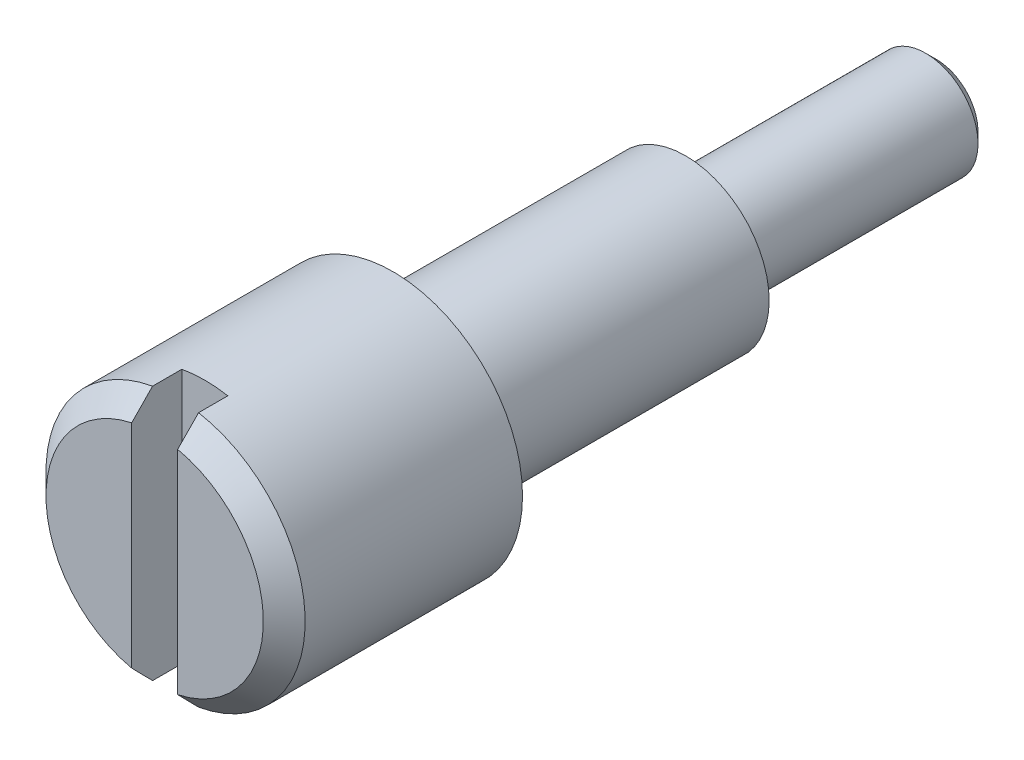
ISO-10303-21;
HEADER;
FILE_DESCRIPTION(('STEP AP214'),'2;1');
FILE_NAME('part.step','',(''),(''),'','','');
FILE_SCHEMA(('AUTOMOTIVE_DESIGN { 1 0 10303 214 1 1 1 1 }'));
ENDSEC;
DATA;
#1=APPLICATION_CONTEXT('core data for automotive mechanical design processes');
#2=APPLICATION_PROTOCOL_DEFINITION('international standard','automotive_design',2000,#1);
#3=PRODUCT_CONTEXT('',#1,'mechanical');
#4=PRODUCT('Part','Part','',(#3));
#5=PRODUCT_RELATED_PRODUCT_CATEGORY('part','',(#4));
#6=PRODUCT_DEFINITION_FORMATION('','',#4);
#7=PRODUCT_DEFINITION_CONTEXT('part definition',#1,'design');
#8=PRODUCT_DEFINITION('design','',#6,#7);
#9=PRODUCT_DEFINITION_SHAPE('','',#8);
#10=(LENGTH_UNIT() NAMED_UNIT(*) SI_UNIT(.MILLI.,.METRE.));
#11=(NAMED_UNIT(*) PLANE_ANGLE_UNIT() SI_UNIT($,.RADIAN.));
#12=(NAMED_UNIT(*) SI_UNIT($,.STERADIAN.) SOLID_ANGLE_UNIT());
#13=UNCERTAINTY_MEASURE_WITH_UNIT(LENGTH_MEASURE(1.E-05),#10,'distance_accuracy_value','');
#14=(GEOMETRIC_REPRESENTATION_CONTEXT(3) GLOBAL_UNCERTAINTY_ASSIGNED_CONTEXT((#13)) GLOBAL_UNIT_ASSIGNED_CONTEXT((#10,
#11,#12)) REPRESENTATION_CONTEXT('',''));
#15=CARTESIAN_POINT('',(0.,0.,0.));
#16=DIRECTION('',(0.,0.,1.));
#17=DIRECTION('',(1.,0.,0.));
#18=AXIS2_PLACEMENT_3D('',#15,#16,#17);
#19=CARTESIAN_POINT('',(0.,0.,5.7));
#20=DIRECTION('',(0.,0.,1.));
#21=DIRECTION('',(1.,0.,0.));
#22=AXIS2_PLACEMENT_3D('',#19,#20,#21);
#23=PLANE('',#22);
#24=DIRECTION('',(0.,1.,0.));
#25=VECTOR('',#24,1.);
#26=CARTESIAN_POINT('',(0.549999999999989,-3.50000000000007,5.69999999999998));
#27=LINE('',#26,#25);
#28=CARTESIAN_POINT('',(0.550000000000013,-2.54116115191469,5.7));
#29=VERTEX_POINT('',#28);
#30=CARTESIAN_POINT('',(0.549999999999971,2.54116115191465,5.7));
#31=VERTEX_POINT('',#30);
#32=EDGE_CURVE('E93',#29,#31,#27,.T.);
#33=ORIENTED_EDGE('',*,*,#32,.F.);
#34=CARTESIAN_POINT('',(0.,0.,5.7));
#35=DIRECTION('',(0.,0.,1.));
#36=DIRECTION('',(1.,0.,0.));
#37=AXIS2_PLACEMENT_3D('',#34,#35,#36);
#38=CIRCLE('',#37,2.6);
#39=EDGE_CURVE('E102',#29,#31,#38,.T.);
#40=ORIENTED_EDGE('',*,*,#39,.T.);
#41=EDGE_LOOP('',(#33,#40));
#42=FACE_BOUND('',#41,.T.);
#43=ADVANCED_FACE('F38',(#42),#23,.T.);
#44=CARTESIAN_POINT('',(0.,0.,5.7));
#45=DIRECTION('',(0.,0.,-1.));
#46=DIRECTION('',(-1.,0.,0.));
#47=AXIS2_PLACEMENT_3D('',#44,#45,#46);
#48=CONICAL_SURFACE('',#47,2.6,0.785398163397443);
#49=CARTESIAN_POINT('',(0.549999999999981,-6.81010362054149,1.46772283037984));
#50=CARTESIAN_POINT('',(0.549999999999968,-6.56766302612039,1.70936961033349));
#51=CARTESIAN_POINT('',(0.549999999999963,-6.32518719488942,1.95098107837741));
#52=CARTESIAN_POINT('',(0.549999999999959,-5.84010536127526,2.43409595939088));
#53=CARTESIAN_POINT('',(0.54999999999996,-5.59749935334166,2.67559936678706));
#54=CARTESIAN_POINT('',(0.549999999999961,-5.11184664048661,3.15871014823581));
#55=CARTESIAN_POINT('',(0.549999999999961,-4.86879974702007,3.40031733280349));
#56=CARTESIAN_POINT('',(0.549999999999961,-4.38245699087287,3.88325893119366));
#57=CARTESIAN_POINT('',(0.549999999999961,-4.13916114000075,4.12459335690603));
#58=CARTESIAN_POINT('',(0.549999999999961,-3.66492836984556,4.59417499355779));
#59=CARTESIAN_POINT('',(0.549999999999961,-3.43401317351567,4.82244412136169));
#60=CARTESIAN_POINT('',(0.549999999999961,-3.08710833741891,5.16434000318874));
#61=CARTESIAN_POINT('',(0.549999999999961,-2.97137673542495,5.27822848254313));
#62=CARTESIAN_POINT('',(0.549999999999961,-2.73966999515021,5.50575443023506));
#63=CARTESIAN_POINT('',(0.549999999999961,-2.62369486012454,5.61939190188651));
#64=CARTESIAN_POINT('',(0.549999999999961,-2.3914687361299,5.84622732702434));
#65=CARTESIAN_POINT('',(0.549999999999961,-2.27521798758484,5.95942552632142));
#66=CARTESIAN_POINT('',(0.549999999999961,-2.04216431942707,6.18526416075464));
#67=CARTESIAN_POINT('',(0.549999999999961,-1.92536137190728,6.29790456709905));
#68=CARTESIAN_POINT('',(0.54999999999996,-1.69089734295985,6.52223735248241));
#69=CARTESIAN_POINT('',(0.549999999999959,-1.5732364733955,6.63392995176102));
#70=CARTESIAN_POINT('',(0.549999999999962,-1.3955196817608,6.80015035197133));
#71=CARTESIAN_POINT('',(0.549999999999963,-1.33607899617753,6.85533513887057));
#72=CARTESIAN_POINT('',(0.549999999999958,-1.21660638813778,6.96506009221091));
#73=CARTESIAN_POINT('',(0.549999999999951,-1.15657448354666,7.01960027802158));
#74=CARTESIAN_POINT('',(0.549999999999955,-1.06240379345596,7.10376578448992));
#75=CARTESIAN_POINT('',(0.549999999999959,-1.02856881730916,7.13373071349409));
#76=CARTESIAN_POINT('',(0.549999999999962,-0.960542659622373,7.19326148579419));
#77=CARTESIAN_POINT('',(0.549999999999962,-0.926351441843123,7.22282728777194));
#78=CARTESIAN_POINT('',(0.54999999999996,-0.857208139466609,7.28168118472351));
#79=CARTESIAN_POINT('',(0.549999999999958,-0.822252004946021,7.31096453591665));
#80=CARTESIAN_POINT('',(0.549999999999963,-0.751729266103548,7.36877062789947));
#81=CARTESIAN_POINT('',(0.54999999999997,-0.716162829703579,7.39729357256621));
#82=CARTESIAN_POINT('',(0.54999999999997,-0.643847393354179,7.45352726863659));
#83=CARTESIAN_POINT('',(0.549999999999963,-0.60709039737414,7.48122780564399));
#84=CARTESIAN_POINT('',(0.549999999999959,-0.532327633152238,7.53501923360642));
#85=CARTESIAN_POINT('',(0.549999999999963,-0.494320299657957,7.56110797942064));
#86=CARTESIAN_POINT('',(0.549999999999959,-0.416948143322115,7.61046275001477));
#87=CARTESIAN_POINT('',(0.549999999999951,-0.377597835554684,7.63375115564689));
#88=CARTESIAN_POINT('',(0.549999999999971,-0.296694026287566,7.67602812398971));
#89=CARTESIAN_POINT('',(0.549999999999998,-0.255147663531901,7.69502967464132));
#90=CARTESIAN_POINT('',(0.549999999999985,-0.17958816759812,7.72221946218261));
#91=CARTESIAN_POINT('',(0.549999999999959,-0.146135878466005,7.73190500174314));
#92=CARTESIAN_POINT('',(0.549999999999962,-0.0781324813903925,7.74546584817642));
#93=CARTESIAN_POINT('',(0.54999999999999,-0.0435861131536746,7.74936343756233));
#94=CARTESIAN_POINT('',(0.549999999999992,0.0257950413628928,7.75049270268285));
#95=CARTESIAN_POINT('',(0.549999999999966,0.0606304083589959,7.74769122685318));
#96=CARTESIAN_POINT('',(0.549999999999956,0.129317980066075,7.73602910046961));
#97=CARTESIAN_POINT('',(0.549999999999972,0.163166569145006,7.72714852579228));
#98=CARTESIAN_POINT('',(0.549999999999977,0.230688924315118,7.70446798704345));
#99=CARTESIAN_POINT('',(0.549999999999965,0.264295323011527,7.69047663770966));
#100=CARTESIAN_POINT('',(0.549999999999957,0.329992576100289,7.65925215287141));
#101=CARTESIAN_POINT('',(0.54999999999996,0.362080477314673,7.64201300105965));
#102=CARTESIAN_POINT('',(0.549999999999961,0.425253479281891,7.60525098243725));
#103=CARTESIAN_POINT('',(0.549999999999959,0.456328067640498,7.58571037622956));
#104=CARTESIAN_POINT('',(0.549999999999963,0.517467168133229,7.54518201954394));
#105=CARTESIAN_POINT('',(0.54999999999997,0.547532547836729,7.52419556197579));
#106=CARTESIAN_POINT('',(0.549999999999971,0.609623318582727,7.47924370247191));
#107=CARTESIAN_POINT('',(0.549999999999963,0.641577824695685,7.45518107125367));
#108=CARTESIAN_POINT('',(0.549999999999958,0.704825160468684,7.40619849900135));
#109=CARTESIAN_POINT('',(0.54999999999996,0.736117901431429,7.3812784442068));
#110=CARTESIAN_POINT('',(0.549999999999963,0.829277808999687,7.30557713927021));
#111=CARTESIAN_POINT('',(0.549999999999961,0.89039633481371,7.25387746617289));
#112=CARTESIAN_POINT('',(0.54999999999996,1.011530993921,7.14900450826239));
#113=CARTESIAN_POINT('',(0.54999999999996,1.07154496773273,7.09582876073386));
#114=CARTESIAN_POINT('',(0.549999999999961,1.19076300555799,6.98861218312275));
#115=CARTESIAN_POINT('',(0.549999999999961,1.24996729450276,6.93457160273256));
#116=CARTESIAN_POINT('',(0.54999999999996,1.36762677650721,6.82609771960421));
#117=CARTESIAN_POINT('',(0.54999999999996,1.42608387721182,6.77166647908638));
#118=CARTESIAN_POINT('',(0.549999999999961,1.54261818807196,6.66239101471584));
#119=CARTESIAN_POINT('',(0.549999999999963,1.60069537081735,6.6075467616662));
#120=CARTESIAN_POINT('',(0.549999999999956,1.77438244279279,6.44269140919765));
#121=CARTESIAN_POINT('',(0.549999999999933,1.8895741751546,6.33224023571159));
#122=CARTESIAN_POINT('',(0.549999999999913,2.20736546243189,6.02578475254654));
#123=CARTESIAN_POINT('',(0.549999999999948,2.40929490766765,5.82908756243329));
#124=CARTESIAN_POINT('',(0.549999999999974,2.8122472560273,5.43476189934849));
#125=CARTESIAN_POINT('',(0.549999999999964,3.01327014117135,5.23713340806399));
#126=CARTESIAN_POINT('',(0.549999999999957,3.41490296061745,4.84125563875944));
#127=CARTESIAN_POINT('',(0.54999999999996,3.61551263643802,4.64300609854953));
#128=CARTESIAN_POINT('',(0.549999999999962,4.01642071708883,4.2461958420766));
#129=CARTESIAN_POINT('',(0.549999999999961,4.21671912428381,4.04763512820085));
#130=CARTESIAN_POINT('',(0.54999999999996,4.6166698776293,3.65074921786539));
#131=CARTESIAN_POINT('',(0.54999999999996,4.81632267231136,3.45242447334283));
#132=CARTESIAN_POINT('',(0.549999999999961,5.21549000015145,3.05563490577654));
#133=CARTESIAN_POINT('',(0.549999999999962,5.41500453295553,2.85717008237681));
#134=CARTESIAN_POINT('',(0.549999999999959,5.81382511805085,2.4602497458265));
#135=CARTESIAN_POINT('',(0.549999999999956,6.01313122467023,2.26179428725844));
#136=CARTESIAN_POINT('',(0.549999999999966,6.41166791686928,1.86480867314105));
#137=CARTESIAN_POINT('',(0.549999999999979,6.61089850266001,1.66627851780362));
#138=CARTESIAN_POINT('',(0.550000000000012,6.81010362054151,1.46772283037984));
#139=B_SPLINE_CURVE_WITH_KNOTS('',3,(#49,#50,#51,#52,#53,#54,#55,#56,#57,#58,#59,#60,#61,#62,
#63,#64,#65,#66,#67,#68,#69,#70,#71,#72,#73,#74,#75,#76,#77,#78,#79,#80,#81,#82,#83,#84,#85,#86,
#87,#88,#89,#90,#91,#92,#93,#94,#95,#96,#97,#98,#99,#100,#101,#102,#103,#104,#105,#106,#107,
#108,#109,#110,#111,#112,#113,#114,#115,#116,#117,#118,#119,#120,#121,#122,#123,#124,#125,#126,
#127,#128,#129,#130,#131,#132,#133,#134,#135,#136,#137,#138),.UNSPECIFIED.,.F.,.F.,(4,2,2,2,2,2,
2,2,2,2,2,2,2,2,2,2,2,2,2,2,2,2,2,2,2,2,2,2,2,2,2,2,2,2,2,2,2,2,2,2,2,2,2,2,4),(0.,
1.02690581406912,2.05385958687024,3.08197053796385,4.11003479616024,5.08412703166865,
5.57124020085457,6.05834690006942,6.54512324757357,7.03192446456293,7.51860928418801,
7.76193149399108,8.00524637354675,8.1408328771417,8.27643331083846,8.41322879174897,
8.54998721903925,8.68803720367462,8.8262671283275,8.96330623882111,9.09992441130855,
9.20402298989877,9.30771976021523,9.41193075431265,9.51648494350356,9.62544133996551,
9.7346015905684,9.84466635047882,9.95463393466169,10.0746171602955,10.1946163668085,
10.4347283552397,10.6752683932283,10.9157401930753,11.1553623461541,11.3950016008045,
11.8737626224392,12.7194429596122,13.5651399960796,14.4112622897591,15.2573781236191,
16.1016205668706,16.9458651634785,17.7896467705172,18.6334260017189),.UNSPECIFIED.);
#140=CARTESIAN_POINT('',(0.550000000000011,-3.05081956201944,5.19999999999999));
#141=VERTEX_POINT('',#140);
#142=EDGE_CURVE('E90',#141,#29,#139,.T.);
#143=ORIENTED_EDGE('',*,*,#142,.F.);
#144=CARTESIAN_POINT('',(0.,0.,5.2));
#145=DIRECTION('',(0.,0.,1.));
#146=DIRECTION('',(1.,0.,0.));
#147=AXIS2_PLACEMENT_3D('',#144,#145,#146);
#148=CIRCLE('',#147,3.1);
#149=CARTESIAN_POINT('',(0.549999999999978,3.05081956201938,5.2));
#150=VERTEX_POINT('',#149);
#151=EDGE_CURVE('E109',#150,#141,#148,.F.);
#152=ORIENTED_EDGE('',*,*,#151,.F.);
#153=EDGE_CURVE('E99',#31,#150,#139,.T.);
#154=ORIENTED_EDGE('',*,*,#153,.F.);
#155=ORIENTED_EDGE('',*,*,#39,.F.);
#156=EDGE_LOOP('',(#143,#152,#154,#155));
#157=FACE_BOUND('',#156,.T.);
#158=ADVANCED_FACE('F104',(#157),#48,.T.);
#159=CARTESIAN_POINT('',(0.,0.,-7.00000000000003));
#160=DIRECTION('',(0.,0.,-1.));
#161=DIRECTION('',(-1.,0.,0.));
#162=AXIS2_PLACEMENT_3D('',#159,#160,#161);
#163=PLANE('',#162);
#164=CARTESIAN_POINT('',(0.,0.,-7.00000000000003));
#165=DIRECTION('',(0.,0.,-1.));
#166=DIRECTION('',(-1.,0.,0.));
#167=AXIS2_PLACEMENT_3D('',#164,#165,#166);
#168=CIRCLE('',#167,2.);
#169=CARTESIAN_POINT('',(-2.00000000000001,0.,-7.00000000000003));
#170=VERTEX_POINT('',#169);
#171=EDGE_CURVE('E268',#170,#170,#168,.T.);
#172=ORIENTED_EDGE('',*,*,#171,.T.);
#173=EDGE_LOOP('',(#172));
#174=FACE_BOUND('',#173,.T.);
#175=CARTESIAN_POINT('',(0.,0.,-7.00000000000003));
#176=DIRECTION('',(0.,0.,-1.));
#177=DIRECTION('',(-1.,0.,0.));
#178=AXIS2_PLACEMENT_3D('',#175,#176,#177);
#179=CIRCLE('',#178,1.25);
#180=CARTESIAN_POINT('',(-1.25000000000001,0.,-7.00000000000003));
#181=VERTEX_POINT('',#180);
#182=EDGE_CURVE('E264',#181,#181,#179,.T.);
#183=ORIENTED_EDGE('',*,*,#182,.F.);
#184=EDGE_LOOP('',(#183));
#185=FACE_BOUND('',#184,.T.);
#186=ADVANCED_FACE('F147',(#174,#185),#163,.T.);
#187=CARTESIAN_POINT('',(0.,0.,0.));
#188=DIRECTION('',(0.,0.,1.));
#189=DIRECTION('',(1.,0.,0.));
#190=AXIS2_PLACEMENT_3D('',#187,#188,#189);
#191=PLANE('',#190);
#192=CARTESIAN_POINT('',(0.,0.,0.));
#193=DIRECTION('',(0.,0.,1.));
#194=DIRECTION('',(1.,0.,0.));
#195=AXIS2_PLACEMENT_3D('',#192,#193,#194);
#196=CIRCLE('',#195,3.1);
#197=CARTESIAN_POINT('',(3.1,0.,0.));
#198=VERTEX_POINT('',#197);
#199=EDGE_CURVE('E276',#198,#198,#196,.T.);
#200=ORIENTED_EDGE('',*,*,#199,.F.);
#201=EDGE_LOOP('',(#200));
#202=FACE_BOUND('',#201,.T.);
#203=CARTESIAN_POINT('',(0.,0.,0.));
#204=DIRECTION('',(0.,0.,1.));
#205=DIRECTION('',(1.,0.,0.));
#206=AXIS2_PLACEMENT_3D('',#203,#204,#205);
#207=CIRCLE('',#206,2.);
#208=CARTESIAN_POINT('',(2.,0.,0.));
#209=VERTEX_POINT('',#208);
#210=EDGE_CURVE('E279',#209,#209,#207,.F.);
#211=ORIENTED_EDGE('',*,*,#210,.F.);
#212=EDGE_LOOP('',(#211));
#213=FACE_BOUND('',#212,.T.);
#214=ADVANCED_FACE('F150',(#202,#213),#191,.F.);
#215=CARTESIAN_POINT('',(0.,0.,5.7));
#216=DIRECTION('',(0.,0.,-1.));
#217=DIRECTION('',(-1.,0.,0.));
#218=AXIS2_PLACEMENT_3D('',#215,#216,#217);
#219=CYLINDRICAL_SURFACE('',#218,3.1);
#220=CARTESIAN_POINT('',(0.,0.,4.5));
#221=DIRECTION('',(0.,0.,-1.));
#222=DIRECTION('',(-1.,0.,0.));
#223=AXIS2_PLACEMENT_3D('',#220,#221,#222);
#224=CIRCLE('',#223,3.1);
#225=CARTESIAN_POINT('',(-0.550000000000051,3.05081956201941,4.49999999999996));
#226=VERTEX_POINT('',#225);
#227=CARTESIAN_POINT('',(0.549999999999962,3.05081956201942,4.5));
#228=VERTEX_POINT('',#227);
#229=EDGE_CURVE('E11',#226,#228,#224,.T.);
#230=ORIENTED_EDGE('',*,*,#229,.T.);
#231=DIRECTION('',(0.,0.,-1.));
#232=VECTOR('',#231,1.);
#233=CARTESIAN_POINT('',(0.549999999999965,3.05081956201942,5.7));
#234=LINE('',#233,#232);
#235=EDGE_CURVE('E265',#228,#150,#234,.F.);
#236=ORIENTED_EDGE('',*,*,#235,.T.);
#237=ORIENTED_EDGE('',*,*,#151,.T.);
#238=DIRECTION('',(0.,0.,-1.));
#239=VECTOR('',#238,1.);
#240=CARTESIAN_POINT('',(0.550000000000012,-3.05081956201944,5.7));
#241=LINE('',#240,#239);
#242=CARTESIAN_POINT('',(0.549999999999984,-3.05081956201943,4.5));
#243=VERTEX_POINT('',#242);
#244=EDGE_CURVE('E62',#141,#243,#241,.T.);
#245=ORIENTED_EDGE('',*,*,#244,.T.);
#246=CARTESIAN_POINT('',(-0.550000000000013,-3.05081956201934,4.49999999999994));
#247=VERTEX_POINT('',#246);
#248=EDGE_CURVE('E43',#243,#247,#224,.T.);
#249=ORIENTED_EDGE('',*,*,#248,.T.);
#250=DIRECTION('',(0.,0.,-1.));
#251=VECTOR('',#250,1.);
#252=CARTESIAN_POINT('',(-0.550000000000037,-3.05081956201932,5.69999999999994));
#253=LINE('',#252,#251);
#254=CARTESIAN_POINT('',(-0.550000000000038,-3.05081956201932,5.19999999999993));
#255=VERTEX_POINT('',#254);
#256=EDGE_CURVE('E256',#247,#255,#253,.F.);
#257=ORIENTED_EDGE('',*,*,#256,.T.);
#258=CARTESIAN_POINT('',(-0.550000000000047,3.05081956201942,5.19999999999995));
#259=VERTEX_POINT('',#258);
#260=EDGE_CURVE('E116',#255,#259,#148,.F.);
#261=ORIENTED_EDGE('',*,*,#260,.T.);
#262=DIRECTION('',(0.,0.,-1.));
#263=VECTOR('',#262,1.);
#264=CARTESIAN_POINT('',(-0.550000000000047,3.05081956201942,5.69999999999995));
#265=LINE('',#264,#263);
#266=EDGE_CURVE('E270',#259,#226,#265,.T.);
#267=ORIENTED_EDGE('',*,*,#266,.T.);
#268=EDGE_LOOP('',(#230,#236,#237,#245,#249,#257,#261,#267));
#269=FACE_BOUND('',#268,.T.);
#270=ORIENTED_EDGE('',*,*,#199,.T.);
#271=EDGE_LOOP('',(#270));
#272=FACE_BOUND('',#271,.T.);
#273=ADVANCED_FACE('F158',(#269,#272),#219,.T.);
#274=DIRECTION('',(0.,-1.,0.));
#275=VECTOR('',#274,1.);
#276=CARTESIAN_POINT('',(-0.550000000000002,-3.5,5.69999999999996));
#277=LINE('',#276,#275);
#278=CARTESIAN_POINT('',(-0.550000000000044,2.54116115191468,5.69999999999994));
#279=VERTEX_POINT('',#278);
#280=CARTESIAN_POINT('',(-0.550000000000008,-2.5411611519146,5.69999999999995));
#281=VERTEX_POINT('',#280);
#282=EDGE_CURVE('E54',#279,#281,#277,.T.);
#283=ORIENTED_EDGE('',*,*,#282,.F.);
#284=EDGE_CURVE('E105',#279,#281,#38,.T.);
#285=ORIENTED_EDGE('',*,*,#284,.T.);
#286=EDGE_LOOP('',(#283,#285));
#287=FACE_BOUND('',#286,.T.);
#288=ADVANCED_FACE('F154',(#287),#23,.T.);
#289=CARTESIAN_POINT('',(0.,0.,-7.00000000000003));
#290=DIRECTION('',(0.,0.,1.));
#291=DIRECTION('',(1.,0.,0.));
#292=AXIS2_PLACEMENT_3D('',#289,#290,#291);
#293=CYLINDRICAL_SURFACE('',#292,2.);
#294=ORIENTED_EDGE('',*,*,#171,.F.);
#295=EDGE_LOOP('',(#294));
#296=FACE_BOUND('',#295,.T.);
#297=ORIENTED_EDGE('',*,*,#210,.T.);
#298=EDGE_LOOP('',(#297));
#299=FACE_BOUND('',#298,.T.);
#300=ADVANCED_FACE('F145',(#296,#299),#293,.T.);
#301=CARTESIAN_POINT('',(0.,0.,-13.));
#302=DIRECTION('',(0.,0.,1.));
#303=DIRECTION('',(1.,0.,0.));
#304=AXIS2_PLACEMENT_3D('',#301,#302,#303);
#305=CYLINDRICAL_SURFACE('',#304,1.25);
#306=CARTESIAN_POINT('',(0.,0.,-12.7465));
#307=DIRECTION('',(0.,0.,-1.));
#308=DIRECTION('',(-1.,0.,0.));
#309=AXIS2_PLACEMENT_3D('',#306,#307,#308);
#310=CIRCLE('',#309,1.25);
#311=CARTESIAN_POINT('',(-1.25,0.,-12.7465));
#312=VERTEX_POINT('',#311);
#313=EDGE_CURVE('E106',#312,#312,#310,.F.);
#314=ORIENTED_EDGE('',*,*,#313,.T.);
#315=EDGE_LOOP('',(#314));
#316=FACE_BOUND('',#315,.T.);
#317=ORIENTED_EDGE('',*,*,#182,.T.);
#318=EDGE_LOOP('',(#317));
#319=FACE_BOUND('',#318,.T.);
#320=ADVANCED_FACE('F141',(#316,#319),#305,.T.);
#321=CARTESIAN_POINT('',(0.,0.,-13.));
#322=DIRECTION('',(0.,0.,-1.));
#323=DIRECTION('',(-1.,0.,0.));
#324=AXIS2_PLACEMENT_3D('',#321,#322,#323);
#325=PLANE('',#324);
#326=CARTESIAN_POINT('',(0.,0.,-13.));
#327=DIRECTION('',(0.,0.,-1.));
#328=DIRECTION('',(-1.,0.,0.));
#329=AXIS2_PLACEMENT_3D('',#326,#327,#328);
#330=CIRCLE('',#329,0.996500000000004);
#331=CARTESIAN_POINT('',(-0.996500000000018,0.,-13.));
#332=VERTEX_POINT('',#331);
#333=EDGE_CURVE('E111',#332,#332,#330,.T.);
#334=ORIENTED_EDGE('',*,*,#333,.T.);
#335=EDGE_LOOP('',(#334));
#336=FACE_BOUND('',#335,.T.);
#337=ADVANCED_FACE('F137',(#336),#325,.T.);
#338=CARTESIAN_POINT('',(0.,0.,-13.));
#339=DIRECTION('',(0.,0.,1.));
#340=DIRECTION('',(1.,0.,0.));
#341=AXIS2_PLACEMENT_3D('',#338,#339,#340);
#342=CONICAL_SURFACE('',#341,0.996500000000004,0.785398163397446);
#343=ORIENTED_EDGE('',*,*,#313,.F.);
#344=EDGE_LOOP('',(#343));
#345=FACE_BOUND('',#344,.T.);
#346=ORIENTED_EDGE('',*,*,#333,.F.);
#347=EDGE_LOOP('',(#346));
#348=FACE_BOUND('',#347,.T.);
#349=ADVANCED_FACE('F140',(#345,#348),#342,.T.);
#350=CARTESIAN_POINT('',(-0.550000000000051,6.81010362054157,1.46772283037979));
#351=CARTESIAN_POINT('',(-0.550000000000025,6.56766302612052,1.70936961033343));
#352=CARTESIAN_POINT('',(-0.550000000000014,6.32518719488959,1.95098107837732));
#353=CARTESIAN_POINT('',(-0.550000000000006,5.8401053612755,2.43409595939074));
#354=CARTESIAN_POINT('',(-0.550000000000009,5.59749935334192,2.67559936678688));
#355=CARTESIAN_POINT('',(-0.550000000000011,5.11184664048695,3.15871014823556));
#356=CARTESIAN_POINT('',(-0.55000000000001,4.86879974702045,3.4003173328032));
#357=CARTESIAN_POINT('',(-0.550000000000009,4.38245699087332,3.8832589311933));
#358=CARTESIAN_POINT('',(-0.55000000000001,4.13916114000124,4.12459335690563));
#359=CARTESIAN_POINT('',(-0.55000000000001,3.66492836984605,4.59417499355739));
#360=CARTESIAN_POINT('',(-0.55000000000001,3.43401317351613,4.82244412136132));
#361=CARTESIAN_POINT('',(-0.55000000000001,3.08710833741932,5.16434000318842));
#362=CARTESIAN_POINT('',(-0.55000000000001,2.97137673542535,5.27822848254282));
#363=CARTESIAN_POINT('',(-0.55000000000001,2.73966999515057,5.50575443023479));
#364=CARTESIAN_POINT('',(-0.550000000000009,2.62369486012489,5.61939190188625));
#365=CARTESIAN_POINT('',(-0.55000000000001,2.39146873613022,5.84622732702412));
#366=CARTESIAN_POINT('',(-0.550000000000011,2.27521798758514,5.95942552632121));
#367=CARTESIAN_POINT('',(-0.550000000000009,2.04216431942734,6.18526416075447));
#368=CARTESIAN_POINT('',(-0.550000000000006,1.92536137190754,6.2979045670989));
#369=CARTESIAN_POINT('',(-0.550000000000013,1.69089734296007,6.52223735248228));
#370=CARTESIAN_POINT('',(-0.550000000000023,1.57323647339569,6.63392995176091));
#371=CARTESIAN_POINT('',(-0.550000000000003,1.39551968176098,6.80015035197126));
#372=CARTESIAN_POINT('',(-0.549999999999991,1.3360789961777,6.85533513887051));
#373=CARTESIAN_POINT('',(-0.550000000000029,1.21660638813791,6.96506009221085));
#374=CARTESIAN_POINT('',(-0.550000000000079,1.15657448354675,7.01960027802149));
#375=CARTESIAN_POINT('',(-0.550000000000051,1.06240379345605,7.10376578448987));
#376=CARTESIAN_POINT('',(-0.55000000000002,1.02856881730927,7.13373071349406));
#377=CARTESIAN_POINT('',(-0.549999999999999,0.960542659622486,7.19326148579419));
#378=CARTESIAN_POINT('',(-0.550000000000008,0.926351441843226,7.22282728777193));
#379=CARTESIAN_POINT('',(-0.550000000000011,0.857208139466706,7.2816811847235));
#380=CARTESIAN_POINT('',(-0.550000000000005,0.822252004946122,7.31096453591666));
#381=CARTESIAN_POINT('',(-0.550000000000014,0.751729266103632,7.36877062789947));
#382=CARTESIAN_POINT('',(-0.55000000000003,0.716162829703642,7.39729357256619));
#383=CARTESIAN_POINT('',(-0.55000000000003,0.643847393354236,7.45352726863657));
#384=CARTESIAN_POINT('',(-0.550000000000014,0.607090397374212,7.48122780564399));
#385=CARTESIAN_POINT('',(-0.550000000000005,0.532327633152321,7.53501923360644));
#386=CARTESIAN_POINT('',(-0.550000000000012,0.494320299658034,7.56110797942065));
#387=CARTESIAN_POINT('',(-0.550000000000007,0.416948143322193,7.61046275001478));
#388=CARTESIAN_POINT('',(-0.549999999999995,0.377597835554768,7.63375115564692));
#389=CARTESIAN_POINT('',(-0.550000000000024,0.296694026287629,7.67602812398971));
#390=CARTESIAN_POINT('',(-0.550000000000065,0.255147663531937,7.69502967464127));
#391=CARTESIAN_POINT('',(-0.550000000000045,0.179588167598153,7.72221946218258));
#392=CARTESIAN_POINT('',(-0.550000000000006,0.146135878466052,7.73190500174315));
#393=CARTESIAN_POINT('',(-0.550000000000013,0.0781324813904536,7.74546584817644));
#394=CARTESIAN_POINT('',(-0.550000000000058,0.0435861131537359,7.74936343756231));
#395=CARTESIAN_POINT('',(-0.550000000000058,-0.0257950413628317,7.75049270268283));
#396=CARTESIAN_POINT('',(-0.550000000000013,-0.0606304083589353,7.74769122685318));
#397=CARTESIAN_POINT('',(-0.550000000000007,-0.129317980066004,7.73602910046961));
#398=CARTESIAN_POINT('',(-0.550000000000046,-0.163166569144924,7.72714852579224));
#399=CARTESIAN_POINT('',(-0.550000000000056,-0.230688924315039,7.7044679870434));
#400=CARTESIAN_POINT('',(-0.550000000000022,-0.264295323011465,7.69047663770964));
#401=CARTESIAN_POINT('',(-0.549999999999997,-0.32999257610024,7.65925215287141));
#402=CARTESIAN_POINT('',(-0.550000000000006,-0.362080477314621,7.64201300105964));
#403=CARTESIAN_POINT('',(-0.550000000000014,-0.425253479281841,7.60525098243723));
#404=CARTESIAN_POINT('',(-0.550000000000013,-0.456328067640451,7.58571037622955));
#405=CARTESIAN_POINT('',(-0.550000000000006,-0.517467168133177,7.54518201954392));
#406=CARTESIAN_POINT('',(-0.549999999999999,-0.547532547836666,7.52419556197574));
#407=CARTESIAN_POINT('',(-0.549999999999998,-0.609623318582664,7.47924370247186));
#408=CARTESIAN_POINT('',(-0.550000000000006,-0.641577824695633,7.45518107125364));
#409=CARTESIAN_POINT('',(-0.550000000000013,-0.704825160468639,7.40619849900133));
#410=CARTESIAN_POINT('',(-0.550000000000011,-0.736117901431379,7.38127844420678));
#411=CARTESIAN_POINT('',(-0.550000000000007,-0.829277808999629,7.30557713927018));
#412=CARTESIAN_POINT('',(-0.550000000000009,-0.890396334813652,7.25387746617287));
#413=CARTESIAN_POINT('',(-0.55000000000001,-1.01153099392094,7.14900450826237));
#414=CARTESIAN_POINT('',(-0.55000000000001,-1.07154496773266,7.09582876073385));
#415=CARTESIAN_POINT('',(-0.550000000000009,-1.19076300555791,6.98861218312275));
#416=CARTESIAN_POINT('',(-0.550000000000009,-1.24996729450268,6.93457160273256));
#417=CARTESIAN_POINT('',(-0.55000000000001,-1.36762677650712,6.82609771960421));
#418=CARTESIAN_POINT('',(-0.550000000000011,-1.42608387721173,6.77166647908639));
#419=CARTESIAN_POINT('',(-0.550000000000009,-1.54261818807187,6.66239101471585));
#420=CARTESIAN_POINT('',(-0.550000000000006,-1.60069537081726,6.60754676166621));
#421=CARTESIAN_POINT('',(-0.550000000000017,-1.77438244279269,6.44269140919766));
#422=CARTESIAN_POINT('',(-0.550000000000048,-1.88957417515448,6.33224023571158));
#423=CARTESIAN_POINT('',(-0.550000000000076,-2.20736546243176,6.0257847525465));
#424=CARTESIAN_POINT('',(-0.550000000000027,-2.40929490766756,5.82908756243327));
#425=CARTESIAN_POINT('',(-0.549999999999992,-2.81224725602726,5.43476189934846));
#426=CARTESIAN_POINT('',(-0.550000000000005,-3.01327014117131,5.23713340806395));
#427=CARTESIAN_POINT('',(-0.550000000000014,-3.41490296061743,4.84125563875938));
#428=CARTESIAN_POINT('',(-0.550000000000011,-3.61551263643801,4.64300609854945));
#429=CARTESIAN_POINT('',(-0.550000000000008,-4.01642071708884,4.24619584207651));
#430=CARTESIAN_POINT('',(-0.550000000000009,-4.21671912428383,4.04763512820074));
#431=CARTESIAN_POINT('',(-0.55000000000001,-4.61666987762933,3.65074921786528));
#432=CARTESIAN_POINT('',(-0.550000000000009,-4.81632267231138,3.45242447334273));
#433=CARTESIAN_POINT('',(-0.55000000000001,-5.21549000015146,3.05563490577645));
#434=CARTESIAN_POINT('',(-0.550000000000011,-5.41500453295552,2.85717008237673));
#435=CARTESIAN_POINT('',(-0.550000000000009,-5.81382511805083,2.46024974582643));
#436=CARTESIAN_POINT('',(-0.550000000000006,-6.01313122467021,2.26179428725838));
#437=CARTESIAN_POINT('',(-0.550000000000013,-6.41166791686924,1.864808673141));
#438=CARTESIAN_POINT('',(-0.550000000000023,-6.61089850265996,1.66627851780358));
#439=CARTESIAN_POINT('',(-0.550000000000047,-6.81010362054146,1.46772283037979));
#440=B_SPLINE_CURVE_WITH_KNOTS('',3,(#350,#351,#352,#353,#354,#355,#356,#357,#358,#359,#360,
#361,#362,#363,#364,#365,#366,#367,#368,#369,#370,#371,#372,#373,#374,#375,#376,#377,#378,#379,
#380,#381,#382,#383,#384,#385,#386,#387,#388,#389,#390,#391,#392,#393,#394,#395,#396,#397,#398,
#399,#400,#401,#402,#403,#404,#405,#406,#407,#408,#409,#410,#411,#412,#413,#414,#415,#416,#417,
#418,#419,#420,#421,#422,#423,#424,#425,#426,#427,#428,#429,#430,#431,#432,#433,#434,#435,#436,
#437,#438,#439),.UNSPECIFIED.,.F.,.F.,(4,2,2,2,2,2,2,2,2,2,2,2,2,2,2,2,2,2,2,2,2,2,2,2,2,2,2,2,
2,2,2,2,2,2,2,2,2,2,2,2,2,2,2,2,4),(0.,1.02690581406898,2.05385958686997,3.08197053796342,
4.11003479615965,5.0841270316682,5.57124020085419,6.0583469000691,6.54512324757333,
7.03192446456276,7.51860928418791,7.76193149399103,8.00524637354673,8.1408328771417,
8.27643331083847,8.413228791749,8.54998721903929,8.68803720367466,8.82626712832754,
8.96330623882116,9.09992441130862,9.20402298989884,9.30771976021528,9.4119307543127,
9.5164849435036,9.62544133996557,9.73460159056845,9.84466635047888,9.95463393466176,
10.0746171602956,10.1946163668086,10.4347283552397,10.6752683932284,10.9157401930753,
11.1553623461541,11.3950016008045,11.8737626224392,12.7194429596122,13.5651399960797,
14.4112622897592,15.2573781236193,16.1016205668707,16.9458651634786,17.7896467705173,
18.633426001719),.UNSPECIFIED.);
#441=EDGE_CURVE('E123',#259,#279,#440,.T.);
#442=ORIENTED_EDGE('',*,*,#441,.F.);
#443=ORIENTED_EDGE('',*,*,#260,.F.);
#444=EDGE_CURVE('E117',#281,#255,#440,.T.);
#445=ORIENTED_EDGE('',*,*,#444,.F.);
#446=ORIENTED_EDGE('',*,*,#284,.F.);
#447=EDGE_LOOP('',(#442,#443,#445,#446));
#448=FACE_BOUND('',#447,.T.);
#449=ADVANCED_FACE('F40',(#448),#48,.T.);
#450=CARTESIAN_POINT('',(0.,0.,4.5));
#451=DIRECTION('',(0.,0.,-1.));
#452=DIRECTION('',(-1.,0.,0.));
#453=AXIS2_PLACEMENT_3D('',#450,#451,#452);
#454=PLANE('',#453);
#455=DIRECTION('',(0.,-1.,0.));
#456=VECTOR('',#455,1.);
#457=CARTESIAN_POINT('',(-0.55000000000001,-3.49999999999999,4.49999999999996));
#458=LINE('',#457,#456);
#459=EDGE_CURVE('E252',#226,#247,#458,.T.);
#460=ORIENTED_EDGE('',*,*,#459,.T.);
#461=ORIENTED_EDGE('',*,*,#248,.F.);
#462=DIRECTION('',(0.,1.,0.));
#463=VECTOR('',#462,1.);
#464=CARTESIAN_POINT('',(0.549999999999961,-3.50000000000005,4.49999999999998));
#465=LINE('',#464,#463);
#466=EDGE_CURVE('E257',#243,#228,#465,.T.);
#467=ORIENTED_EDGE('',*,*,#466,.T.);
#468=ORIENTED_EDGE('',*,*,#229,.F.);
#469=EDGE_LOOP('',(#460,#461,#467,#468));
#470=FACE_BOUND('',#469,.T.);
#471=ADVANCED_FACE('F133',(#470),#454,.F.);
#472=CARTESIAN_POINT('',(0.549999999999961,-3.50000000000005,4.49999999999998));
#473=DIRECTION('',(1.,0.,0.));
#474=DIRECTION('',(0.,0.,-1.));
#475=AXIS2_PLACEMENT_3D('',#472,#473,#474);
#476=PLANE('',#475);
#477=ORIENTED_EDGE('',*,*,#142,.T.);
#478=ORIENTED_EDGE('',*,*,#32,.T.);
#479=ORIENTED_EDGE('',*,*,#153,.T.);
#480=ORIENTED_EDGE('',*,*,#235,.F.);
#481=ORIENTED_EDGE('',*,*,#466,.F.);
#482=ORIENTED_EDGE('',*,*,#244,.F.);
#483=EDGE_LOOP('',(#477,#478,#479,#480,#481,#482));
#484=FACE_BOUND('',#483,.T.);
#485=ADVANCED_FACE('F92',(#484),#476,.F.);
#486=CARTESIAN_POINT('',(-0.55000000000001,-3.49999999999999,4.49999999999996));
#487=DIRECTION('',(-1.,0.,0.));
#488=DIRECTION('',(0.,0.,1.));
#489=AXIS2_PLACEMENT_3D('',#486,#487,#488);
#490=PLANE('',#489);
#491=ORIENTED_EDGE('',*,*,#441,.T.);
#492=ORIENTED_EDGE('',*,*,#282,.T.);
#493=ORIENTED_EDGE('',*,*,#444,.T.);
#494=ORIENTED_EDGE('',*,*,#256,.F.);
#495=ORIENTED_EDGE('',*,*,#459,.F.);
#496=ORIENTED_EDGE('',*,*,#266,.F.);
#497=EDGE_LOOP('',(#491,#492,#493,#494,#495,#496));
#498=FACE_BOUND('',#497,.T.);
#499=ADVANCED_FACE('F129',(#498),#490,.F.);
#500=CLOSED_SHELL('',(#43,#158,#186,#214,#273,#288,#300,#320,#337,#349,#449,#471,#485,#499));
#501=MANIFOLD_SOLID_BREP('B2',#500);
#502=ADVANCED_BREP_SHAPE_REPRESENTATION('',(#18,#501),#14);
#503=SHAPE_DEFINITION_REPRESENTATION(#9,#502);
ENDSEC;
END-ISO-10303-21;
